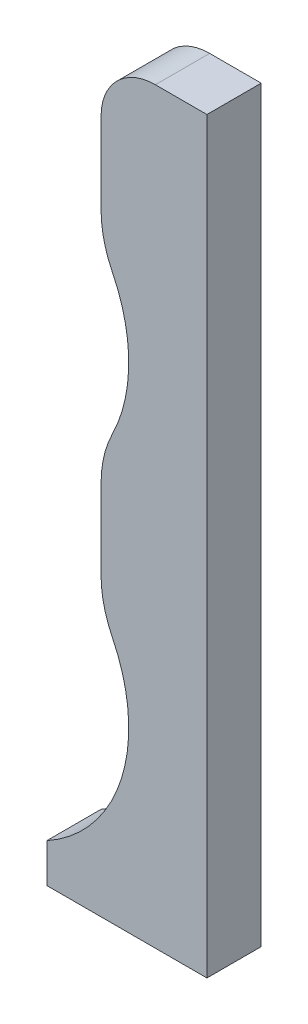
ISO-10303-21;
HEADER;
FILE_DESCRIPTION(('STEP AP214'),'2;1');
FILE_NAME('part.step','',(''),(''),'','','');
FILE_SCHEMA(('AUTOMOTIVE_DESIGN { 1 0 10303 214 1 1 1 1 }'));
ENDSEC;
DATA;
#1=APPLICATION_CONTEXT('core data for automotive mechanical design processes');
#2=APPLICATION_PROTOCOL_DEFINITION('international standard','automotive_design',2000,#1);
#3=PRODUCT_CONTEXT('',#1,'mechanical');
#4=PRODUCT('Part','Part','',(#3));
#5=PRODUCT_RELATED_PRODUCT_CATEGORY('part','',(#4));
#6=PRODUCT_DEFINITION_FORMATION('','',#4);
#7=PRODUCT_DEFINITION_CONTEXT('part definition',#1,'design');
#8=PRODUCT_DEFINITION('design','',#6,#7);
#9=PRODUCT_DEFINITION_SHAPE('','',#8);
#10=(LENGTH_UNIT() NAMED_UNIT(*) SI_UNIT(.MILLI.,.METRE.));
#11=(NAMED_UNIT(*) PLANE_ANGLE_UNIT() SI_UNIT($,.RADIAN.));
#12=(NAMED_UNIT(*) SI_UNIT($,.STERADIAN.) SOLID_ANGLE_UNIT());
#13=UNCERTAINTY_MEASURE_WITH_UNIT(LENGTH_MEASURE(1.E-05),#10,'distance_accuracy_value','');
#14=(GEOMETRIC_REPRESENTATION_CONTEXT(3) GLOBAL_UNCERTAINTY_ASSIGNED_CONTEXT((#13)) GLOBAL_UNIT_ASSIGNED_CONTEXT((#10,
#11,#12)) REPRESENTATION_CONTEXT('',''));
#15=CARTESIAN_POINT('',(0.,0.,0.));
#16=DIRECTION('',(0.,0.,1.));
#17=DIRECTION('',(1.,0.,0.));
#18=AXIS2_PLACEMENT_3D('',#15,#16,#17);
#19=CARTESIAN_POINT('',(3223.90381121799,2654.94761073645,3.175));
#20=DIRECTION('',(0.,0.,-1.));
#21=DIRECTION('',(-1.,0.,0.));
#22=AXIS2_PLACEMENT_3D('',#19,#20,#21);
#23=CYLINDRICAL_SURFACE('',#22,9.25195000000001);
#24=CARTESIAN_POINT('',(3223.90381121799,2654.94761073645,0.));
#25=DIRECTION('',(0.,0.,-1.));
#26=DIRECTION('',(1.,0.,0.));
#27=AXIS2_PLACEMENT_3D('',#24,#25,#26);
#28=CIRCLE('',#27,9.25195000000001);
#29=CARTESIAN_POINT('',(3232.19643572276,2659.05016574835,0.));
#30=VERTEX_POINT('',#29);
#31=CARTESIAN_POINT('',(3228.36301053732,2646.84118610947,0.));
#32=VERTEX_POINT('',#31);
#33=EDGE_CURVE('E153',#30,#32,#28,.T.);
#34=ORIENTED_EDGE('',*,*,#33,.T.);
#35=DIRECTION('',(0.,0.,-1.));
#36=VECTOR('',#35,1.);
#37=CARTESIAN_POINT('',(3228.36301053732,2646.84118610947,3.175));
#38=LINE('',#37,#36);
#39=CARTESIAN_POINT('',(3228.36301053732,2646.84118610947,3.175));
#40=VERTEX_POINT('',#39);
#41=EDGE_CURVE('E11',#40,#32,#38,.T.);
#42=ORIENTED_EDGE('',*,*,#41,.F.);
#43=CARTESIAN_POINT('',(3223.90381121799,2654.94761073645,3.175));
#44=DIRECTION('',(0.,0.,-1.));
#45=DIRECTION('',(1.,0.,0.));
#46=AXIS2_PLACEMENT_3D('',#43,#44,#45);
#47=CIRCLE('',#46,9.25195000000001);
#48=CARTESIAN_POINT('',(3232.19643572276,2659.05016574835,3.175));
#49=VERTEX_POINT('',#48);
#50=EDGE_CURVE('E175',#49,#40,#47,.T.);
#51=ORIENTED_EDGE('',*,*,#50,.F.);
#52=DIRECTION('',(0.,0.,-1.));
#53=VECTOR('',#52,1.);
#54=CARTESIAN_POINT('',(3232.19643572276,2659.05016574835,3.175));
#55=LINE('',#54,#53);
#56=EDGE_CURVE('E149',#49,#30,#55,.T.);
#57=ORIENTED_EDGE('',*,*,#56,.T.);
#58=EDGE_LOOP('',(#34,#42,#51,#57));
#59=FACE_BOUND('',#58,.T.);
#60=ADVANCED_FACE('F33',(#59),#23,.F.);
#61=CARTESIAN_POINT('',(3228.3630105373,2644.56776329367,3.175));
#62=DIRECTION('',(1.,-1.0157652484031E-11,0.));
#63=DIRECTION('',(1.0157652484031E-11,1.,0.));
#64=AXIS2_PLACEMENT_3D('',#61,#62,#63);
#65=PLANE('',#64);
#66=DIRECTION('',(-1.0157652484031E-11,-1.,0.));
#67=VECTOR('',#66,1.);
#68=CARTESIAN_POINT('',(3228.3630105373,2644.56776329367,0.));
#69=LINE('',#68,#67);
#70=CARTESIAN_POINT('',(3228.3630105373,2644.56776329367,0.));
#71=VERTEX_POINT('',#70);
#72=EDGE_CURVE('E156',#32,#71,#69,.T.);
#73=ORIENTED_EDGE('',*,*,#72,.T.);
#74=DIRECTION('',(0.,0.,-1.));
#75=VECTOR('',#74,1.);
#76=CARTESIAN_POINT('',(3228.3630105373,2644.56776329367,3.175));
#77=LINE('',#76,#75);
#78=CARTESIAN_POINT('',(3228.3630105373,2644.56776329367,3.175));
#79=VERTEX_POINT('',#78);
#80=EDGE_CURVE('E41',#79,#71,#77,.T.);
#81=ORIENTED_EDGE('',*,*,#80,.F.);
#82=DIRECTION('',(-1.0157652484031E-11,-1.,0.));
#83=VECTOR('',#82,1.);
#84=CARTESIAN_POINT('',(3228.3630105373,2644.56776329367,3.175));
#85=LINE('',#84,#83);
#86=EDGE_CURVE('E104',#40,#79,#85,.T.);
#87=ORIENTED_EDGE('',*,*,#86,.F.);
#88=ORIENTED_EDGE('',*,*,#41,.T.);
#89=EDGE_LOOP('',(#73,#81,#87,#88));
#90=FACE_BOUND('',#89,.T.);
#91=ADVANCED_FACE('F253',(#90),#65,.F.);
#92=CARTESIAN_POINT('',(3237.72776121799,2644.56776329367,3.175));
#93=DIRECTION('',(0.,1.,0.));
#94=DIRECTION('',(0.,0.,1.));
#95=AXIS2_PLACEMENT_3D('',#92,#93,#94);
#96=PLANE('',#95);
#97=DIRECTION('',(1.,0.,0.));
#98=VECTOR('',#97,1.);
#99=CARTESIAN_POINT('',(3237.72776121799,2644.56776329367,0.));
#100=LINE('',#99,#98);
#101=CARTESIAN_POINT('',(3237.72776121799,2644.56776329367,0.));
#102=VERTEX_POINT('',#101);
#103=EDGE_CURVE('E158',#71,#102,#100,.T.);
#104=ORIENTED_EDGE('',*,*,#103,.T.);
#105=DIRECTION('',(0.,0.,-1.));
#106=VECTOR('',#105,1.);
#107=CARTESIAN_POINT('',(3237.72776121799,2644.56776329367,3.175));
#108=LINE('',#107,#106);
#109=CARTESIAN_POINT('',(3237.72776121799,2644.56776329367,3.175));
#110=VERTEX_POINT('',#109);
#111=EDGE_CURVE('E194',#110,#102,#108,.T.);
#112=ORIENTED_EDGE('',*,*,#111,.F.);
#113=DIRECTION('',(1.,0.,0.));
#114=VECTOR('',#113,1.);
#115=CARTESIAN_POINT('',(3237.72776121799,2644.56776329367,3.175));
#116=LINE('',#115,#114);
#117=EDGE_CURVE('E202',#79,#110,#116,.T.);
#118=ORIENTED_EDGE('',*,*,#117,.F.);
#119=ORIENTED_EDGE('',*,*,#80,.T.);
#120=EDGE_LOOP('',(#104,#112,#118,#119));
#121=FACE_BOUND('',#120,.T.);
#122=ADVANCED_FACE('F200',(#121),#96,.F.);
#123=CARTESIAN_POINT('',(3237.72776121799,2688.29702007527,3.175));
#124=DIRECTION('',(-1.,0.,0.));
#125=DIRECTION('',(0.,0.,1.));
#126=AXIS2_PLACEMENT_3D('',#123,#124,#125);
#127=PLANE('',#126);
#128=DIRECTION('',(0.,1.,0.));
#129=VECTOR('',#128,1.);
#130=CARTESIAN_POINT('',(3237.72776121799,2688.29702007527,0.));
#131=LINE('',#130,#129);
#132=CARTESIAN_POINT('',(3237.72776121799,2688.29702007527,0.));
#133=VERTEX_POINT('',#132);
#134=EDGE_CURVE('E160',#102,#133,#131,.T.);
#135=ORIENTED_EDGE('',*,*,#134,.T.);
#136=DIRECTION('',(0.,0.,-1.));
#137=VECTOR('',#136,1.);
#138=CARTESIAN_POINT('',(3237.72776121799,2688.29702007527,3.175));
#139=LINE('',#138,#137);
#140=CARTESIAN_POINT('',(3237.72776121799,2688.29702007527,3.175));
#141=VERTEX_POINT('',#140);
#142=EDGE_CURVE('E191',#141,#133,#139,.T.);
#143=ORIENTED_EDGE('',*,*,#142,.F.);
#144=DIRECTION('',(0.,1.,0.));
#145=VECTOR('',#144,1.);
#146=CARTESIAN_POINT('',(3237.72776121799,2688.29702007527,3.175));
#147=LINE('',#146,#145);
#148=EDGE_CURVE('E220',#110,#141,#147,.T.);
#149=ORIENTED_EDGE('',*,*,#148,.F.);
#150=ORIENTED_EDGE('',*,*,#111,.T.);
#151=EDGE_LOOP('',(#135,#143,#149,#150));
#152=FACE_BOUND('',#151,.T.);
#153=ADVANCED_FACE('F211',(#152),#127,.F.);
#154=CARTESIAN_POINT('',(3237.72776121799,2688.29702007527,3.175));
#155=DIRECTION('',(0.,-1.,0.));
#156=DIRECTION('',(0.,0.,-1.));
#157=AXIS2_PLACEMENT_3D('',#154,#155,#156);
#158=PLANE('',#157);
#159=DIRECTION('',(-1.,0.,0.));
#160=VECTOR('',#159,1.);
#161=CARTESIAN_POINT('',(3237.72776121799,2688.29702007527,0.));
#162=LINE('',#161,#160);
#163=CARTESIAN_POINT('',(3234.7130105373,2688.29702007527,0.));
#164=VERTEX_POINT('',#163);
#165=EDGE_CURVE('E162',#133,#164,#162,.T.);
#166=ORIENTED_EDGE('',*,*,#165,.T.);
#167=DIRECTION('',(0.,0.,-1.));
#168=VECTOR('',#167,1.);
#169=CARTESIAN_POINT('',(3234.7130105373,2688.29702007527,3.175));
#170=LINE('',#169,#168);
#171=CARTESIAN_POINT('',(3234.7130105373,2688.29702007527,3.175));
#172=VERTEX_POINT('',#171);
#173=EDGE_CURVE('E188',#172,#164,#170,.T.);
#174=ORIENTED_EDGE('',*,*,#173,.F.);
#175=DIRECTION('',(-1.,0.,0.));
#176=VECTOR('',#175,1.);
#177=CARTESIAN_POINT('',(3237.72776121799,2688.29702007527,3.175));
#178=LINE('',#177,#176);
#179=EDGE_CURVE('E217',#141,#172,#178,.T.);
#180=ORIENTED_EDGE('',*,*,#179,.F.);
#181=ORIENTED_EDGE('',*,*,#142,.T.);
#182=EDGE_LOOP('',(#166,#174,#180,#181));
#183=FACE_BOUND('',#182,.T.);
#184=ADVANCED_FACE('F215',(#183),#158,.F.);
#185=CARTESIAN_POINT('',(3234.7130105373,2685.12202007527,3.175));
#186=DIRECTION('',(0.,0.,-1.));
#187=DIRECTION('',(-1.,0.,0.));
#188=AXIS2_PLACEMENT_3D('',#185,#186,#187);
#189=CYLINDRICAL_SURFACE('',#188,3.17500000000015);
#190=CARTESIAN_POINT('',(3234.7130105373,2685.12202007527,0.));
#191=DIRECTION('',(0.,0.,1.));
#192=DIRECTION('',(1.,0.,0.));
#193=AXIS2_PLACEMENT_3D('',#190,#191,#192);
#194=CIRCLE('',#193,3.17500000000015);
#195=CARTESIAN_POINT('',(3231.5380105373,2685.12202007527,0.));
#196=VERTEX_POINT('',#195);
#197=EDGE_CURVE('E164',#164,#196,#194,.T.);
#198=ORIENTED_EDGE('',*,*,#197,.T.);
#199=DIRECTION('',(0.,0.,-1.));
#200=VECTOR('',#199,1.);
#201=CARTESIAN_POINT('',(3231.5380105373,2685.12202007527,3.175));
#202=LINE('',#201,#200);
#203=CARTESIAN_POINT('',(3231.5380105373,2685.12202007527,3.175));
#204=VERTEX_POINT('',#203);
#205=EDGE_CURVE('E185',#204,#196,#202,.T.);
#206=ORIENTED_EDGE('',*,*,#205,.F.);
#207=CARTESIAN_POINT('',(3234.7130105373,2685.12202007527,3.175));
#208=DIRECTION('',(0.,0.,1.));
#209=DIRECTION('',(1.,0.,0.));
#210=AXIS2_PLACEMENT_3D('',#207,#208,#209);
#211=CIRCLE('',#210,3.17500000000015);
#212=EDGE_CURVE('E219',#172,#204,#211,.T.);
#213=ORIENTED_EDGE('',*,*,#212,.F.);
#214=ORIENTED_EDGE('',*,*,#173,.T.);
#215=EDGE_LOOP('',(#198,#206,#213,#214));
#216=FACE_BOUND('',#215,.T.);
#217=ADVANCED_FACE('F266',(#216),#189,.T.);
#218=CARTESIAN_POINT('',(3231.5380105373,2680.3698207325,3.175));
#219=DIRECTION('',(1.,0.,0.));
#220=DIRECTION('',(0.,0.,-1.));
#221=AXIS2_PLACEMENT_3D('',#218,#219,#220);
#222=PLANE('',#221);
#223=DIRECTION('',(0.,-1.,0.));
#224=VECTOR('',#223,1.);
#225=CARTESIAN_POINT('',(3231.5380105373,2680.3698207325,0.));
#226=LINE('',#225,#224);
#227=CARTESIAN_POINT('',(3231.5380105373,2680.3698207325,0.));
#228=VERTEX_POINT('',#227);
#229=EDGE_CURVE('E166',#196,#228,#226,.T.);
#230=ORIENTED_EDGE('',*,*,#229,.T.);
#231=DIRECTION('',(0.,0.,-1.));
#232=VECTOR('',#231,1.);
#233=CARTESIAN_POINT('',(3231.5380105373,2680.3698207325,3.175));
#234=LINE('',#233,#232);
#235=CARTESIAN_POINT('',(3231.5380105373,2680.3698207325,3.175));
#236=VERTEX_POINT('',#235);
#237=EDGE_CURVE('E182',#236,#228,#234,.T.);
#238=ORIENTED_EDGE('',*,*,#237,.F.);
#239=DIRECTION('',(0.,-1.,0.));
#240=VECTOR('',#239,1.);
#241=CARTESIAN_POINT('',(3231.5380105373,2680.3698207325,3.175));
#242=LINE('',#241,#240);
#243=EDGE_CURVE('E222',#204,#236,#242,.T.);
#244=ORIENTED_EDGE('',*,*,#243,.F.);
#245=ORIENTED_EDGE('',*,*,#205,.T.);
#246=EDGE_LOOP('',(#230,#238,#244,#245));
#247=FACE_BOUND('',#246,.T.);
#248=ADVANCED_FACE('F269',(#247),#222,.F.);
#249=CARTESIAN_POINT('',(3237.8880105373,2680.36982073242,3.175));
#250=DIRECTION('',(0.,0.,-1.));
#251=DIRECTION('',(-1.,0.,0.));
#252=AXIS2_PLACEMENT_3D('',#249,#250,#251);
#253=CYLINDRICAL_SURFACE('',#252,6.35000000000017);
#254=CARTESIAN_POINT('',(3237.8880105373,2680.36982073242,0.));
#255=DIRECTION('',(0.,0.,1.));
#256=DIRECTION('',(1.,0.,0.));
#257=AXIS2_PLACEMENT_3D('',#254,#255,#256);
#258=CIRCLE('',#257,6.35000000000017);
#259=CARTESIAN_POINT('',(3232.19643572275,2677.55406574834,0.));
#260=VERTEX_POINT('',#259);
#261=EDGE_CURVE('E168',#228,#260,#258,.T.);
#262=ORIENTED_EDGE('',*,*,#261,.T.);
#263=DIRECTION('',(0.,0.,-1.));
#264=VECTOR('',#263,1.);
#265=CARTESIAN_POINT('',(3232.19643572275,2677.55406574834,3.175));
#266=LINE('',#265,#264);
#267=CARTESIAN_POINT('',(3232.19643572275,2677.55406574834,3.175));
#268=VERTEX_POINT('',#267);
#269=EDGE_CURVE('E179',#268,#260,#266,.T.);
#270=ORIENTED_EDGE('',*,*,#269,.F.);
#271=CARTESIAN_POINT('',(3237.8880105373,2680.36982073242,3.175));
#272=DIRECTION('',(0.,0.,1.));
#273=DIRECTION('',(1.,0.,0.));
#274=AXIS2_PLACEMENT_3D('',#271,#272,#273);
#275=CIRCLE('',#274,6.35000000000017);
#276=EDGE_CURVE('E228',#236,#268,#275,.T.);
#277=ORIENTED_EDGE('',*,*,#276,.F.);
#278=ORIENTED_EDGE('',*,*,#237,.T.);
#279=EDGE_LOOP('',(#262,#270,#277,#278));
#280=FACE_BOUND('',#279,.T.);
#281=ADVANCED_FACE('F234',(#280),#253,.T.);
#282=CARTESIAN_POINT('',(3223.90381121799,2673.45151073645,3.175));
#283=DIRECTION('',(0.,0.,-1.));
#284=DIRECTION('',(-1.,0.,0.));
#285=AXIS2_PLACEMENT_3D('',#282,#283,#284);
#286=CYLINDRICAL_SURFACE('',#285,9.25195000000082);
#287=CARTESIAN_POINT('',(3223.90381121799,2673.45151073645,0.));
#288=DIRECTION('',(0.,0.,-1.));
#289=DIRECTION('',(1.,0.,0.));
#290=AXIS2_PLACEMENT_3D('',#287,#288,#289);
#291=CIRCLE('',#290,9.25195000000082);
#292=CARTESIAN_POINT('',(3232.19643572275,2669.34895572457,0.));
#293=VERTEX_POINT('',#292);
#294=EDGE_CURVE('E170',#260,#293,#291,.T.);
#295=ORIENTED_EDGE('',*,*,#294,.T.);
#296=DIRECTION('',(0.,0.,-1.));
#297=VECTOR('',#296,1.);
#298=CARTESIAN_POINT('',(3232.19643572275,2669.34895572457,3.175));
#299=LINE('',#298,#297);
#300=CARTESIAN_POINT('',(3232.19643572275,2669.34895572457,3.175));
#301=VERTEX_POINT('',#300);
#302=EDGE_CURVE('E144',#301,#293,#299,.T.);
#303=ORIENTED_EDGE('',*,*,#302,.F.);
#304=CARTESIAN_POINT('',(3223.90381121799,2673.45151073645,3.175));
#305=DIRECTION('',(0.,0.,-1.));
#306=DIRECTION('',(1.,0.,0.));
#307=AXIS2_PLACEMENT_3D('',#304,#305,#306);
#308=CIRCLE('',#307,9.25195000000082);
#309=EDGE_CURVE('E135',#268,#301,#308,.T.);
#310=ORIENTED_EDGE('',*,*,#309,.F.);
#311=ORIENTED_EDGE('',*,*,#269,.T.);
#312=EDGE_LOOP('',(#295,#303,#310,#311));
#313=FACE_BOUND('',#312,.T.);
#314=ADVANCED_FACE('F238',(#313),#286,.F.);
#315=CARTESIAN_POINT('',(3237.8880105373,2666.53320074048,3.175));
#316=DIRECTION('',(0.,0.,-1.));
#317=DIRECTION('',(-1.,0.,0.));
#318=AXIS2_PLACEMENT_3D('',#315,#316,#317);
#319=CYLINDRICAL_SURFACE('',#318,6.35000000000017);
#320=CARTESIAN_POINT('',(3237.8880105373,2666.53320074048,0.));
#321=DIRECTION('',(0.,0.,1.));
#322=DIRECTION('',(1.,0.,0.));
#323=AXIS2_PLACEMENT_3D('',#320,#321,#322);
#324=CIRCLE('',#323,6.35000000000017);
#325=CARTESIAN_POINT('',(3231.5380105373,2666.53320074041,0.));
#326=VERTEX_POINT('',#325);
#327=EDGE_CURVE('E143',#293,#326,#324,.T.);
#328=ORIENTED_EDGE('',*,*,#327,.T.);
#329=DIRECTION('',(0.,0.,-1.));
#330=VECTOR('',#329,1.);
#331=CARTESIAN_POINT('',(3231.5380105373,2666.53320074041,3.175));
#332=LINE('',#331,#330);
#333=CARTESIAN_POINT('',(3231.5380105373,2666.53320074041,3.175));
#334=VERTEX_POINT('',#333);
#335=EDGE_CURVE('E140',#334,#326,#332,.T.);
#336=ORIENTED_EDGE('',*,*,#335,.F.);
#337=CARTESIAN_POINT('',(3237.8880105373,2666.53320074048,3.175));
#338=DIRECTION('',(0.,0.,1.));
#339=DIRECTION('',(1.,0.,0.));
#340=AXIS2_PLACEMENT_3D('',#337,#338,#339);
#341=CIRCLE('',#340,6.35000000000017);
#342=EDGE_CURVE('E129',#301,#334,#341,.T.);
#343=ORIENTED_EDGE('',*,*,#342,.F.);
#344=ORIENTED_EDGE('',*,*,#302,.T.);
#345=EDGE_LOOP('',(#328,#336,#343,#344));
#346=FACE_BOUND('',#345,.T.);
#347=ADVANCED_FACE('F141',(#346),#319,.T.);
#348=CARTESIAN_POINT('',(3231.5380105373,2661.8659207325,3.175));
#349=DIRECTION('',(1.,0.,0.));
#350=DIRECTION('',(0.,1.,0.));
#351=AXIS2_PLACEMENT_3D('',#348,#349,#350);
#352=PLANE('',#351);
#353=DIRECTION('',(0.,-1.,0.));
#354=VECTOR('',#353,1.);
#355=CARTESIAN_POINT('',(3231.5380105373,2661.8659207325,0.));
#356=LINE('',#355,#354);
#357=CARTESIAN_POINT('',(3231.5380105373,2661.8659207325,0.));
#358=VERTEX_POINT('',#357);
#359=EDGE_CURVE('E90',#326,#358,#356,.T.);
#360=ORIENTED_EDGE('',*,*,#359,.T.);
#361=DIRECTION('',(0.,0.,-1.));
#362=VECTOR('',#361,1.);
#363=CARTESIAN_POINT('',(3231.5380105373,2661.8659207325,3.175));
#364=LINE('',#363,#362);
#365=CARTESIAN_POINT('',(3231.5380105373,2661.8659207325,3.175));
#366=VERTEX_POINT('',#365);
#367=EDGE_CURVE('E145',#366,#358,#364,.T.);
#368=ORIENTED_EDGE('',*,*,#367,.F.);
#369=DIRECTION('',(0.,-1.,0.));
#370=VECTOR('',#369,1.);
#371=CARTESIAN_POINT('',(3231.5380105373,2661.8659207325,3.175));
#372=LINE('',#371,#370);
#373=EDGE_CURVE('E133',#334,#366,#372,.T.);
#374=ORIENTED_EDGE('',*,*,#373,.F.);
#375=ORIENTED_EDGE('',*,*,#335,.T.);
#376=EDGE_LOOP('',(#360,#368,#374,#375));
#377=FACE_BOUND('',#376,.T.);
#378=ADVANCED_FACE('F147',(#377),#352,.F.);
#379=CARTESIAN_POINT('',(3237.8880105373,2661.8659207325,3.175));
#380=DIRECTION('',(0.,0.,-1.));
#381=DIRECTION('',(-1.,0.,0.));
#382=AXIS2_PLACEMENT_3D('',#379,#380,#381);
#383=CYLINDRICAL_SURFACE('',#382,6.35000000001681);
#384=CARTESIAN_POINT('',(3237.8880105373,2661.8659207325,0.));
#385=DIRECTION('',(0.,0.,1.));
#386=DIRECTION('',(1.,0.,0.));
#387=AXIS2_PLACEMENT_3D('',#384,#385,#386);
#388=CIRCLE('',#387,6.35000000001681);
#389=EDGE_CURVE('E96',#358,#30,#388,.T.);
#390=ORIENTED_EDGE('',*,*,#389,.T.);
#391=ORIENTED_EDGE('',*,*,#56,.F.);
#392=CARTESIAN_POINT('',(3237.8880105373,2661.8659207325,3.175));
#393=DIRECTION('',(0.,0.,1.));
#394=DIRECTION('',(1.,0.,0.));
#395=AXIS2_PLACEMENT_3D('',#392,#393,#394);
#396=CIRCLE('',#395,6.35000000001681);
#397=EDGE_CURVE('E49',#366,#49,#396,.T.);
#398=ORIENTED_EDGE('',*,*,#397,.F.);
#399=ORIENTED_EDGE('',*,*,#367,.T.);
#400=EDGE_LOOP('',(#390,#391,#398,#399));
#401=FACE_BOUND('',#400,.T.);
#402=ADVANCED_FACE('F242',(#401),#383,.T.);
#403=CARTESIAN_POINT('',(3223.90381121799,2654.94761073645,3.175));
#404=DIRECTION('',(0.,0.,1.));
#405=DIRECTION('',(1.,0.,0.));
#406=AXIS2_PLACEMENT_3D('',#403,#404,#405);
#407=PLANE('',#406);
#408=ORIENTED_EDGE('',*,*,#50,.T.);
#409=ORIENTED_EDGE('',*,*,#86,.T.);
#410=ORIENTED_EDGE('',*,*,#117,.T.);
#411=ORIENTED_EDGE('',*,*,#148,.T.);
#412=ORIENTED_EDGE('',*,*,#179,.T.);
#413=ORIENTED_EDGE('',*,*,#212,.T.);
#414=ORIENTED_EDGE('',*,*,#243,.T.);
#415=ORIENTED_EDGE('',*,*,#276,.T.);
#416=ORIENTED_EDGE('',*,*,#309,.T.);
#417=ORIENTED_EDGE('',*,*,#342,.T.);
#418=ORIENTED_EDGE('',*,*,#373,.T.);
#419=ORIENTED_EDGE('',*,*,#397,.T.);
#420=EDGE_LOOP('',(#408,#409,#410,#411,#412,#413,#414,#415,#416,#417,#418,#419));
#421=FACE_BOUND('',#420,.T.);
#422=ADVANCED_FACE('F131',(#421),#407,.T.);
#423=CARTESIAN_POINT('',(3223.90381121799,2654.94761073645,0.));
#424=DIRECTION('',(0.,0.,1.));
#425=DIRECTION('',(1.,0.,0.));
#426=AXIS2_PLACEMENT_3D('',#423,#424,#425);
#427=PLANE('',#426);
#428=ORIENTED_EDGE('',*,*,#33,.F.);
#429=ORIENTED_EDGE('',*,*,#389,.F.);
#430=ORIENTED_EDGE('',*,*,#359,.F.);
#431=ORIENTED_EDGE('',*,*,#327,.F.);
#432=ORIENTED_EDGE('',*,*,#294,.F.);
#433=ORIENTED_EDGE('',*,*,#261,.F.);
#434=ORIENTED_EDGE('',*,*,#229,.F.);
#435=ORIENTED_EDGE('',*,*,#197,.F.);
#436=ORIENTED_EDGE('',*,*,#165,.F.);
#437=ORIENTED_EDGE('',*,*,#134,.F.);
#438=ORIENTED_EDGE('',*,*,#103,.F.);
#439=ORIENTED_EDGE('',*,*,#72,.F.);
#440=EDGE_LOOP('',(#428,#429,#430,#431,#432,#433,#434,#435,#436,#437,#438,#439));
#441=FACE_BOUND('',#440,.T.);
#442=ADVANCED_FACE('F206',(#441),#427,.F.);
#443=CLOSED_SHELL('',(#60,#91,#122,#153,#184,#217,#248,#281,#314,#347,#378,#402,#422,#442));
#444=MANIFOLD_SOLID_BREP('B2',#443);
#445=ADVANCED_BREP_SHAPE_REPRESENTATION('',(#18,#444),#14);
#446=SHAPE_DEFINITION_REPRESENTATION(#9,#445);
ENDSEC;
END-ISO-10303-21;
